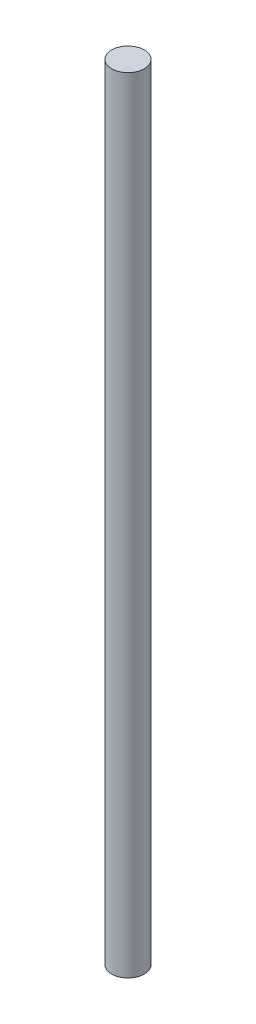
ISO-10303-21;
HEADER;
FILE_DESCRIPTION(('STEP AP214'),'2;1');
FILE_NAME('part.step','',(''),(''),'','','');
FILE_SCHEMA(('AUTOMOTIVE_DESIGN { 1 0 10303 214 1 1 1 1 }'));
ENDSEC;
DATA;
#1=APPLICATION_CONTEXT('core data for automotive mechanical design processes');
#2=APPLICATION_PROTOCOL_DEFINITION('international standard','automotive_design',2000,#1);
#3=PRODUCT_CONTEXT('',#1,'mechanical');
#4=PRODUCT('Part','Part','',(#3));
#5=PRODUCT_RELATED_PRODUCT_CATEGORY('part','',(#4));
#6=PRODUCT_DEFINITION_FORMATION('','',#4);
#7=PRODUCT_DEFINITION_CONTEXT('part definition',#1,'design');
#8=PRODUCT_DEFINITION('design','',#6,#7);
#9=PRODUCT_DEFINITION_SHAPE('','',#8);
#10=(LENGTH_UNIT() NAMED_UNIT(*) SI_UNIT(.MILLI.,.METRE.));
#11=(NAMED_UNIT(*) PLANE_ANGLE_UNIT() SI_UNIT($,.RADIAN.));
#12=(NAMED_UNIT(*) SI_UNIT($,.STERADIAN.) SOLID_ANGLE_UNIT());
#13=UNCERTAINTY_MEASURE_WITH_UNIT(LENGTH_MEASURE(1.E-05),#10,'distance_accuracy_value','');
#14=(GEOMETRIC_REPRESENTATION_CONTEXT(3) GLOBAL_UNCERTAINTY_ASSIGNED_CONTEXT((#13)) GLOBAL_UNIT_ASSIGNED_CONTEXT((#10,
#11,#12)) REPRESENTATION_CONTEXT('',''));
#15=CARTESIAN_POINT('',(0.,0.,0.));
#16=DIRECTION('',(0.,0.,1.));
#17=DIRECTION('',(1.,0.,0.));
#18=AXIS2_PLACEMENT_3D('',#15,#16,#17);
#19=CARTESIAN_POINT('',(0.,72.,0.));
#20=DIRECTION('',(0.,-1.,0.));
#21=DIRECTION('',(0.,0.,-1.));
#22=AXIS2_PLACEMENT_3D('',#19,#20,#21);
#23=CYLINDRICAL_SURFACE('',#22,1.5);
#24=CARTESIAN_POINT('',(0.,72.,0.));
#25=DIRECTION('',(0.,1.,0.));
#26=DIRECTION('',(0.,0.,1.));
#27=AXIS2_PLACEMENT_3D('',#24,#25,#26);
#28=CIRCLE('',#27,1.5);
#29=CARTESIAN_POINT('',(0.,72.,1.5));
#30=VERTEX_POINT('',#29);
#31=EDGE_CURVE('E10',#30,#30,#28,.T.);
#32=ORIENTED_EDGE('',*,*,#31,.F.);
#33=EDGE_LOOP('',(#32));
#34=FACE_BOUND('',#33,.T.);
#35=CARTESIAN_POINT('',(0.,0.,0.));
#36=DIRECTION('',(0.,1.,0.));
#37=DIRECTION('',(0.,0.,1.));
#38=AXIS2_PLACEMENT_3D('',#35,#36,#37);
#39=CIRCLE('',#38,1.5);
#40=CARTESIAN_POINT('',(0.,0.,1.5));
#41=VERTEX_POINT('',#40);
#42=EDGE_CURVE('E40',#41,#41,#39,.T.);
#43=ORIENTED_EDGE('',*,*,#42,.T.);
#44=EDGE_LOOP('',(#43));
#45=FACE_BOUND('',#44,.T.);
#46=ADVANCED_FACE('F37',(#34,#45),#23,.T.);
#47=CARTESIAN_POINT('',(0.,72.,0.));
#48=DIRECTION('',(0.,1.,0.));
#49=DIRECTION('',(0.,0.,1.));
#50=AXIS2_PLACEMENT_3D('',#47,#48,#49);
#51=PLANE('',#50);
#52=ORIENTED_EDGE('',*,*,#31,.T.);
#53=EDGE_LOOP('',(#52));
#54=FACE_BOUND('',#53,.T.);
#55=ADVANCED_FACE('F52',(#54),#51,.T.);
#56=CARTESIAN_POINT('',(0.,0.,0.));
#57=DIRECTION('',(0.,1.,0.));
#58=DIRECTION('',(0.,0.,1.));
#59=AXIS2_PLACEMENT_3D('',#56,#57,#58);
#60=PLANE('',#59);
#61=ORIENTED_EDGE('',*,*,#42,.F.);
#62=EDGE_LOOP('',(#61));
#63=FACE_BOUND('',#62,.T.);
#64=ADVANCED_FACE('F50',(#63),#60,.F.);
#65=CLOSED_SHELL('',(#46,#55,#64));
#66=MANIFOLD_SOLID_BREP('B2',#65);
#67=ADVANCED_BREP_SHAPE_REPRESENTATION('',(#18,#66),#14);
#68=SHAPE_DEFINITION_REPRESENTATION(#9,#67);
ENDSEC;
END-ISO-10303-21;
